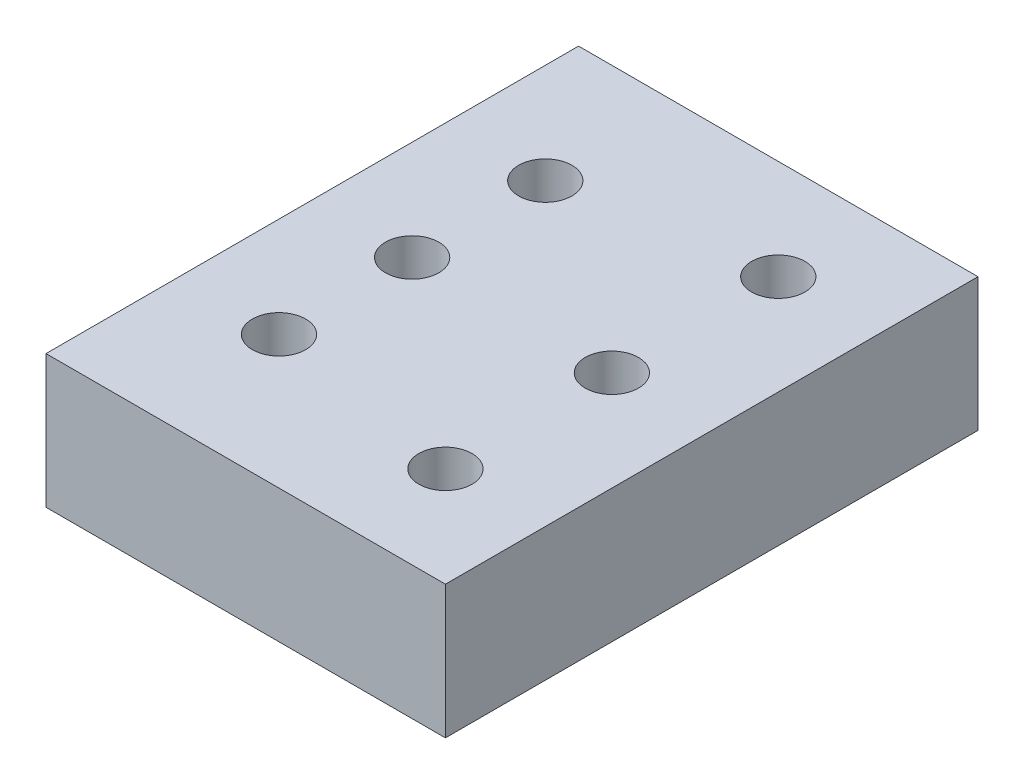
ISO-10303-21;
HEADER;
FILE_DESCRIPTION(('STEP AP214'),'2;1');
FILE_NAME('part.step','',(''),(''),'','','');
FILE_SCHEMA(('AUTOMOTIVE_DESIGN { 1 0 10303 214 1 1 1 1 }'));
ENDSEC;
DATA;
#1=APPLICATION_CONTEXT('core data for automotive mechanical design processes');
#2=APPLICATION_PROTOCOL_DEFINITION('international standard','automotive_design',2000,#1);
#3=PRODUCT_CONTEXT('',#1,'mechanical');
#4=PRODUCT('Part','Part','',(#3));
#5=PRODUCT_RELATED_PRODUCT_CATEGORY('part','',(#4));
#6=PRODUCT_DEFINITION_FORMATION('','',#4);
#7=PRODUCT_DEFINITION_CONTEXT('part definition',#1,'design');
#8=PRODUCT_DEFINITION('design','',#6,#7);
#9=PRODUCT_DEFINITION_SHAPE('','',#8);
#10=(LENGTH_UNIT() NAMED_UNIT(*) SI_UNIT(.MILLI.,.METRE.));
#11=(NAMED_UNIT(*) PLANE_ANGLE_UNIT() SI_UNIT($,.RADIAN.));
#12=(NAMED_UNIT(*) SI_UNIT($,.STERADIAN.) SOLID_ANGLE_UNIT());
#13=UNCERTAINTY_MEASURE_WITH_UNIT(LENGTH_MEASURE(1.E-05),#10,'distance_accuracy_value','');
#14=(GEOMETRIC_REPRESENTATION_CONTEXT(3) GLOBAL_UNCERTAINTY_ASSIGNED_CONTEXT((#13)) GLOBAL_UNIT_ASSIGNED_CONTEXT((#10,
#11,#12)) REPRESENTATION_CONTEXT('',''));
#15=CARTESIAN_POINT('',(0.,0.,0.));
#16=DIRECTION('',(0.,0.,1.));
#17=DIRECTION('',(1.,0.,0.));
#18=AXIS2_PLACEMENT_3D('',#15,#16,#17);
#19=CARTESIAN_POINT('',(0.,10.,0.));
#20=DIRECTION('',(0.,1.,0.));
#21=DIRECTION('',(0.,0.,1.));
#22=AXIS2_PLACEMENT_3D('',#19,#20,#21);
#23=PLANE('',#22);
#24=CARTESIAN_POINT('',(-7.5,10.,-10.));
#25=DIRECTION('',(0.,1.,0.));
#26=DIRECTION('',(0.,0.,1.));
#27=AXIS2_PLACEMENT_3D('',#24,#25,#26);
#28=CIRCLE('',#27,2.);
#29=CARTESIAN_POINT('',(-7.5,10.,-8.));
#30=VERTEX_POINT('',#29);
#31=EDGE_CURVE('E133',#30,#30,#28,.T.);
#32=ORIENTED_EDGE('',*,*,#31,.F.);
#33=EDGE_LOOP('',(#32));
#34=FACE_BOUND('',#33,.T.);
#35=CARTESIAN_POINT('',(7.5,10.,12.5));
#36=DIRECTION('',(0.,1.,0.));
#37=DIRECTION('',(0.,0.,1.));
#38=AXIS2_PLACEMENT_3D('',#35,#36,#37);
#39=CIRCLE('',#38,2.);
#40=CARTESIAN_POINT('',(7.5,10.,14.5));
#41=VERTEX_POINT('',#40);
#42=EDGE_CURVE('E121',#41,#41,#39,.T.);
#43=ORIENTED_EDGE('',*,*,#42,.F.);
#44=EDGE_LOOP('',(#43));
#45=FACE_BOUND('',#44,.T.);
#46=CARTESIAN_POINT('',(7.5,10.,-12.5));
#47=DIRECTION('',(0.,1.,0.));
#48=DIRECTION('',(0.,0.,1.));
#49=AXIS2_PLACEMENT_3D('',#46,#47,#48);
#50=CIRCLE('',#49,2.);
#51=CARTESIAN_POINT('',(7.5,10.,-10.5));
#52=VERTEX_POINT('',#51);
#53=EDGE_CURVE('E100',#52,#52,#50,.T.);
#54=ORIENTED_EDGE('',*,*,#53,.F.);
#55=EDGE_LOOP('',(#54));
#56=FACE_BOUND('',#55,.T.);
#57=DIRECTION('',(0.,0.,1.));
#58=VECTOR('',#57,1.);
#59=CARTESIAN_POINT('',(-15.,10.,-20.));
#60=LINE('',#59,#58);
#61=CARTESIAN_POINT('',(-15.,10.,-20.));
#62=VERTEX_POINT('',#61);
#63=CARTESIAN_POINT('',(-15.,10.,20.));
#64=VERTEX_POINT('',#63);
#65=EDGE_CURVE('E85',#62,#64,#60,.T.);
#66=ORIENTED_EDGE('',*,*,#65,.T.);
#67=DIRECTION('',(1.,0.,0.));
#68=VECTOR('',#67,1.);
#69=CARTESIAN_POINT('',(-15.,10.,20.));
#70=LINE('',#69,#68);
#71=CARTESIAN_POINT('',(15.,10.,20.));
#72=VERTEX_POINT('',#71);
#73=EDGE_CURVE('E80',#64,#72,#70,.T.);
#74=ORIENTED_EDGE('',*,*,#73,.T.);
#75=DIRECTION('',(0.,0.,-1.));
#76=VECTOR('',#75,1.);
#77=CARTESIAN_POINT('',(15.,10.,-20.));
#78=LINE('',#77,#76);
#79=CARTESIAN_POINT('',(15.,10.,-20.));
#80=VERTEX_POINT('',#79);
#81=EDGE_CURVE('E83',#72,#80,#78,.T.);
#82=ORIENTED_EDGE('',*,*,#81,.T.);
#83=DIRECTION('',(-1.,0.,0.));
#84=VECTOR('',#83,1.);
#85=CARTESIAN_POINT('',(-15.,10.,-20.));
#86=LINE('',#85,#84);
#87=EDGE_CURVE('E50',#80,#62,#86,.T.);
#88=ORIENTED_EDGE('',*,*,#87,.T.);
#89=EDGE_LOOP('',(#66,#74,#82,#88));
#90=FACE_BOUND('',#89,.T.);
#91=CARTESIAN_POINT('',(-7.5,10.,0.));
#92=DIRECTION('',(0.,1.,0.));
#93=DIRECTION('',(0.,0.,1.));
#94=AXIS2_PLACEMENT_3D('',#91,#92,#93);
#95=CIRCLE('',#94,2.);
#96=CARTESIAN_POINT('',(-7.5,10.,2.));
#97=VERTEX_POINT('',#96);
#98=EDGE_CURVE('E115',#97,#97,#95,.T.);
#99=ORIENTED_EDGE('',*,*,#98,.F.);
#100=EDGE_LOOP('',(#99));
#101=FACE_BOUND('',#100,.T.);
#102=CARTESIAN_POINT('',(-7.5,10.,10.));
#103=DIRECTION('',(0.,1.,0.));
#104=DIRECTION('',(0.,0.,1.));
#105=AXIS2_PLACEMENT_3D('',#102,#103,#104);
#106=CIRCLE('',#105,2.);
#107=CARTESIAN_POINT('',(-7.5,10.,12.));
#108=VERTEX_POINT('',#107);
#109=EDGE_CURVE('E127',#108,#108,#106,.T.);
#110=ORIENTED_EDGE('',*,*,#109,.F.);
#111=EDGE_LOOP('',(#110));
#112=FACE_BOUND('',#111,.T.);
#113=CARTESIAN_POINT('',(7.5,10.,0.));
#114=DIRECTION('',(0.,1.,0.));
#115=DIRECTION('',(0.,0.,1.));
#116=AXIS2_PLACEMENT_3D('',#113,#114,#115);
#117=CIRCLE('',#116,2.);
#118=CARTESIAN_POINT('',(7.5,10.,2.));
#119=VERTEX_POINT('',#118);
#120=EDGE_CURVE('E139',#119,#119,#117,.T.);
#121=ORIENTED_EDGE('',*,*,#120,.F.);
#122=EDGE_LOOP('',(#121));
#123=FACE_BOUND('',#122,.T.);
#124=ADVANCED_FACE('F33',(#34,#45,#56,#90,#101,#112,#123),#23,.T.);
#125=CARTESIAN_POINT('',(0.,0.,0.));
#126=DIRECTION('',(0.,1.,0.));
#127=DIRECTION('',(0.,0.,1.));
#128=AXIS2_PLACEMENT_3D('',#125,#126,#127);
#129=PLANE('',#128);
#130=DIRECTION('',(0.,0.,1.));
#131=VECTOR('',#130,1.);
#132=CARTESIAN_POINT('',(-15.,0.,-20.));
#133=LINE('',#132,#131);
#134=CARTESIAN_POINT('',(-15.,0.,-20.));
#135=VERTEX_POINT('',#134);
#136=CARTESIAN_POINT('',(-15.,0.,20.));
#137=VERTEX_POINT('',#136);
#138=EDGE_CURVE('E97',#135,#137,#133,.T.);
#139=ORIENTED_EDGE('',*,*,#138,.F.);
#140=DIRECTION('',(-1.,0.,0.));
#141=VECTOR('',#140,1.);
#142=CARTESIAN_POINT('',(-15.,0.,-20.));
#143=LINE('',#142,#141);
#144=CARTESIAN_POINT('',(15.,0.,-20.));
#145=VERTEX_POINT('',#144);
#146=EDGE_CURVE('E73',#145,#135,#143,.T.);
#147=ORIENTED_EDGE('',*,*,#146,.F.);
#148=DIRECTION('',(0.,0.,-1.));
#149=VECTOR('',#148,1.);
#150=CARTESIAN_POINT('',(15.,0.,-20.));
#151=LINE('',#150,#149);
#152=CARTESIAN_POINT('',(15.,0.,20.));
#153=VERTEX_POINT('',#152);
#154=EDGE_CURVE('E67',#153,#145,#151,.T.);
#155=ORIENTED_EDGE('',*,*,#154,.F.);
#156=DIRECTION('',(1.,0.,0.));
#157=VECTOR('',#156,1.);
#158=CARTESIAN_POINT('',(-15.,0.,20.));
#159=LINE('',#158,#157);
#160=EDGE_CURVE('E89',#137,#153,#159,.T.);
#161=ORIENTED_EDGE('',*,*,#160,.F.);
#162=EDGE_LOOP('',(#139,#147,#155,#161));
#163=FACE_BOUND('',#162,.T.);
#164=CARTESIAN_POINT('',(7.5,0.,-12.5));
#165=DIRECTION('',(0.,1.,0.));
#166=DIRECTION('',(0.,0.,1.));
#167=AXIS2_PLACEMENT_3D('',#164,#165,#166);
#168=CIRCLE('',#167,2.);
#169=CARTESIAN_POINT('',(7.5,0.,-10.5));
#170=VERTEX_POINT('',#169);
#171=EDGE_CURVE('E112',#170,#170,#168,.T.);
#172=ORIENTED_EDGE('',*,*,#171,.T.);
#173=EDGE_LOOP('',(#172));
#174=FACE_BOUND('',#173,.T.);
#175=CARTESIAN_POINT('',(-7.5,0.,0.));
#176=DIRECTION('',(0.,1.,0.));
#177=DIRECTION('',(0.,0.,1.));
#178=AXIS2_PLACEMENT_3D('',#175,#176,#177);
#179=CIRCLE('',#178,2.);
#180=CARTESIAN_POINT('',(-7.5,0.,2.));
#181=VERTEX_POINT('',#180);
#182=EDGE_CURVE('E118',#181,#181,#179,.T.);
#183=ORIENTED_EDGE('',*,*,#182,.T.);
#184=EDGE_LOOP('',(#183));
#185=FACE_BOUND('',#184,.T.);
#186=CARTESIAN_POINT('',(7.5,0.,12.5));
#187=DIRECTION('',(0.,1.,0.));
#188=DIRECTION('',(0.,0.,1.));
#189=AXIS2_PLACEMENT_3D('',#186,#187,#188);
#190=CIRCLE('',#189,2.);
#191=CARTESIAN_POINT('',(7.5,0.,14.5));
#192=VERTEX_POINT('',#191);
#193=EDGE_CURVE('E124',#192,#192,#190,.T.);
#194=ORIENTED_EDGE('',*,*,#193,.T.);
#195=EDGE_LOOP('',(#194));
#196=FACE_BOUND('',#195,.T.);
#197=CARTESIAN_POINT('',(-7.5,0.,10.));
#198=DIRECTION('',(0.,1.,0.));
#199=DIRECTION('',(0.,0.,1.));
#200=AXIS2_PLACEMENT_3D('',#197,#198,#199);
#201=CIRCLE('',#200,2.);
#202=CARTESIAN_POINT('',(-7.5,0.,12.));
#203=VERTEX_POINT('',#202);
#204=EDGE_CURVE('E130',#203,#203,#201,.T.);
#205=ORIENTED_EDGE('',*,*,#204,.T.);
#206=EDGE_LOOP('',(#205));
#207=FACE_BOUND('',#206,.T.);
#208=CARTESIAN_POINT('',(-7.5,0.,-10.));
#209=DIRECTION('',(0.,1.,0.));
#210=DIRECTION('',(0.,0.,1.));
#211=AXIS2_PLACEMENT_3D('',#208,#209,#210);
#212=CIRCLE('',#211,2.);
#213=CARTESIAN_POINT('',(-7.5,0.,-8.));
#214=VERTEX_POINT('',#213);
#215=EDGE_CURVE('E136',#214,#214,#212,.T.);
#216=ORIENTED_EDGE('',*,*,#215,.T.);
#217=EDGE_LOOP('',(#216));
#218=FACE_BOUND('',#217,.T.);
#219=CARTESIAN_POINT('',(7.5,0.,0.));
#220=DIRECTION('',(0.,1.,0.));
#221=DIRECTION('',(0.,0.,1.));
#222=AXIS2_PLACEMENT_3D('',#219,#220,#221);
#223=CIRCLE('',#222,2.);
#224=CARTESIAN_POINT('',(7.5,0.,2.));
#225=VERTEX_POINT('',#224);
#226=EDGE_CURVE('E142',#225,#225,#223,.T.);
#227=ORIENTED_EDGE('',*,*,#226,.T.);
#228=EDGE_LOOP('',(#227));
#229=FACE_BOUND('',#228,.T.);
#230=ADVANCED_FACE('F108',(#163,#174,#185,#196,#207,#218,#229),#129,.F.);
#231=CARTESIAN_POINT('',(-15.,10.,-20.));
#232=DIRECTION('',(1.,0.,0.));
#233=DIRECTION('',(0.,0.,-1.));
#234=AXIS2_PLACEMENT_3D('',#231,#232,#233);
#235=PLANE('',#234);
#236=ORIENTED_EDGE('',*,*,#138,.T.);
#237=DIRECTION('',(0.,-1.,0.));
#238=VECTOR('',#237,1.);
#239=CARTESIAN_POINT('',(-15.,10.,20.));
#240=LINE('',#239,#238);
#241=EDGE_CURVE('E11',#64,#137,#240,.T.);
#242=ORIENTED_EDGE('',*,*,#241,.F.);
#243=ORIENTED_EDGE('',*,*,#65,.F.);
#244=DIRECTION('',(0.,-1.,0.));
#245=VECTOR('',#244,1.);
#246=CARTESIAN_POINT('',(-15.,10.,-20.));
#247=LINE('',#246,#245);
#248=EDGE_CURVE('E93',#62,#135,#247,.T.);
#249=ORIENTED_EDGE('',*,*,#248,.T.);
#250=EDGE_LOOP('',(#236,#242,#243,#249));
#251=FACE_BOUND('',#250,.T.);
#252=ADVANCED_FACE('F35',(#251),#235,.F.);
#253=CARTESIAN_POINT('',(-15.,10.,20.));
#254=DIRECTION('',(0.,0.,-1.));
#255=DIRECTION('',(-1.,0.,0.));
#256=AXIS2_PLACEMENT_3D('',#253,#254,#255);
#257=PLANE('',#256);
#258=ORIENTED_EDGE('',*,*,#160,.T.);
#259=DIRECTION('',(0.,-1.,0.));
#260=VECTOR('',#259,1.);
#261=CARTESIAN_POINT('',(15.,10.,20.));
#262=LINE('',#261,#260);
#263=EDGE_CURVE('E42',#72,#153,#262,.T.);
#264=ORIENTED_EDGE('',*,*,#263,.F.);
#265=ORIENTED_EDGE('',*,*,#73,.F.);
#266=ORIENTED_EDGE('',*,*,#241,.T.);
#267=EDGE_LOOP('',(#258,#264,#265,#266));
#268=FACE_BOUND('',#267,.T.);
#269=ADVANCED_FACE('F88',(#268),#257,.F.);
#270=CARTESIAN_POINT('',(15.,10.,-20.));
#271=DIRECTION('',(-1.,0.,0.));
#272=DIRECTION('',(0.,0.,1.));
#273=AXIS2_PLACEMENT_3D('',#270,#271,#272);
#274=PLANE('',#273);
#275=ORIENTED_EDGE('',*,*,#154,.T.);
#276=DIRECTION('',(0.,-1.,0.));
#277=VECTOR('',#276,1.);
#278=CARTESIAN_POINT('',(15.,10.,-20.));
#279=LINE('',#278,#277);
#280=EDGE_CURVE('E90',#80,#145,#279,.T.);
#281=ORIENTED_EDGE('',*,*,#280,.F.);
#282=ORIENTED_EDGE('',*,*,#81,.F.);
#283=ORIENTED_EDGE('',*,*,#263,.T.);
#284=EDGE_LOOP('',(#275,#281,#282,#283));
#285=FACE_BOUND('',#284,.T.);
#286=ADVANCED_FACE('F91',(#285),#274,.F.);
#287=CARTESIAN_POINT('',(-15.,10.,-20.));
#288=DIRECTION('',(0.,0.,1.));
#289=DIRECTION('',(1.,0.,0.));
#290=AXIS2_PLACEMENT_3D('',#287,#288,#289);
#291=PLANE('',#290);
#292=ORIENTED_EDGE('',*,*,#146,.T.);
#293=ORIENTED_EDGE('',*,*,#248,.F.);
#294=ORIENTED_EDGE('',*,*,#87,.F.);
#295=ORIENTED_EDGE('',*,*,#280,.T.);
#296=EDGE_LOOP('',(#292,#293,#294,#295));
#297=FACE_BOUND('',#296,.T.);
#298=ADVANCED_FACE('F105',(#297),#291,.F.);
#299=CARTESIAN_POINT('',(7.5,10.,-12.5));
#300=DIRECTION('',(0.,-1.,0.));
#301=DIRECTION('',(0.,0.,-1.));
#302=AXIS2_PLACEMENT_3D('',#299,#300,#301);
#303=CYLINDRICAL_SURFACE('',#302,2.);
#304=ORIENTED_EDGE('',*,*,#53,.T.);
#305=EDGE_LOOP('',(#304));
#306=FACE_BOUND('',#305,.T.);
#307=ORIENTED_EDGE('',*,*,#171,.F.);
#308=EDGE_LOOP('',(#307));
#309=FACE_BOUND('',#308,.T.);
#310=ADVANCED_FACE('F161',(#306,#309),#303,.F.);
#311=CARTESIAN_POINT('',(-7.5,10.,0.));
#312=DIRECTION('',(0.,-1.,0.));
#313=DIRECTION('',(0.,0.,-1.));
#314=AXIS2_PLACEMENT_3D('',#311,#312,#313);
#315=CYLINDRICAL_SURFACE('',#314,2.);
#316=ORIENTED_EDGE('',*,*,#98,.T.);
#317=EDGE_LOOP('',(#316));
#318=FACE_BOUND('',#317,.T.);
#319=ORIENTED_EDGE('',*,*,#182,.F.);
#320=EDGE_LOOP('',(#319));
#321=FACE_BOUND('',#320,.T.);
#322=ADVANCED_FACE('F207',(#318,#321),#315,.F.);
#323=CARTESIAN_POINT('',(7.5,10.,12.5));
#324=DIRECTION('',(0.,-1.,0.));
#325=DIRECTION('',(0.,0.,-1.));
#326=AXIS2_PLACEMENT_3D('',#323,#324,#325);
#327=CYLINDRICAL_SURFACE('',#326,2.);
#328=ORIENTED_EDGE('',*,*,#42,.T.);
#329=EDGE_LOOP('',(#328));
#330=FACE_BOUND('',#329,.T.);
#331=ORIENTED_EDGE('',*,*,#193,.F.);
#332=EDGE_LOOP('',(#331));
#333=FACE_BOUND('',#332,.T.);
#334=ADVANCED_FACE('F215',(#330,#333),#327,.F.);
#335=CARTESIAN_POINT('',(-7.5,10.,10.));
#336=DIRECTION('',(0.,-1.,0.));
#337=DIRECTION('',(0.,0.,-1.));
#338=AXIS2_PLACEMENT_3D('',#335,#336,#337);
#339=CYLINDRICAL_SURFACE('',#338,2.);
#340=ORIENTED_EDGE('',*,*,#109,.T.);
#341=EDGE_LOOP('',(#340));
#342=FACE_BOUND('',#341,.T.);
#343=ORIENTED_EDGE('',*,*,#204,.F.);
#344=EDGE_LOOP('',(#343));
#345=FACE_BOUND('',#344,.T.);
#346=ADVANCED_FACE('F223',(#342,#345),#339,.F.);
#347=CARTESIAN_POINT('',(-7.5,10.,-10.));
#348=DIRECTION('',(0.,-1.,0.));
#349=DIRECTION('',(0.,0.,-1.));
#350=AXIS2_PLACEMENT_3D('',#347,#348,#349);
#351=CYLINDRICAL_SURFACE('',#350,2.);
#352=ORIENTED_EDGE('',*,*,#31,.T.);
#353=EDGE_LOOP('',(#352));
#354=FACE_BOUND('',#353,.T.);
#355=ORIENTED_EDGE('',*,*,#215,.F.);
#356=EDGE_LOOP('',(#355));
#357=FACE_BOUND('',#356,.T.);
#358=ADVANCED_FACE('F232',(#354,#357),#351,.F.);
#359=CARTESIAN_POINT('',(7.5,10.,0.));
#360=DIRECTION('',(0.,-1.,0.));
#361=DIRECTION('',(0.,0.,-1.));
#362=AXIS2_PLACEMENT_3D('',#359,#360,#361);
#363=CYLINDRICAL_SURFACE('',#362,2.);
#364=ORIENTED_EDGE('',*,*,#120,.T.);
#365=EDGE_LOOP('',(#364));
#366=FACE_BOUND('',#365,.T.);
#367=ORIENTED_EDGE('',*,*,#226,.F.);
#368=EDGE_LOOP('',(#367));
#369=FACE_BOUND('',#368,.T.);
#370=ADVANCED_FACE('F148',(#366,#369),#363,.F.);
#371=CLOSED_SHELL('',(#124,#230,#252,#269,#286,#298,#310,#322,#334,#346,#358,#370));
#372=MANIFOLD_SOLID_BREP('B2',#371);
#373=ADVANCED_BREP_SHAPE_REPRESENTATION('',(#18,#372),#14);
#374=SHAPE_DEFINITION_REPRESENTATION(#9,#373);
ENDSEC;
END-ISO-10303-21;
